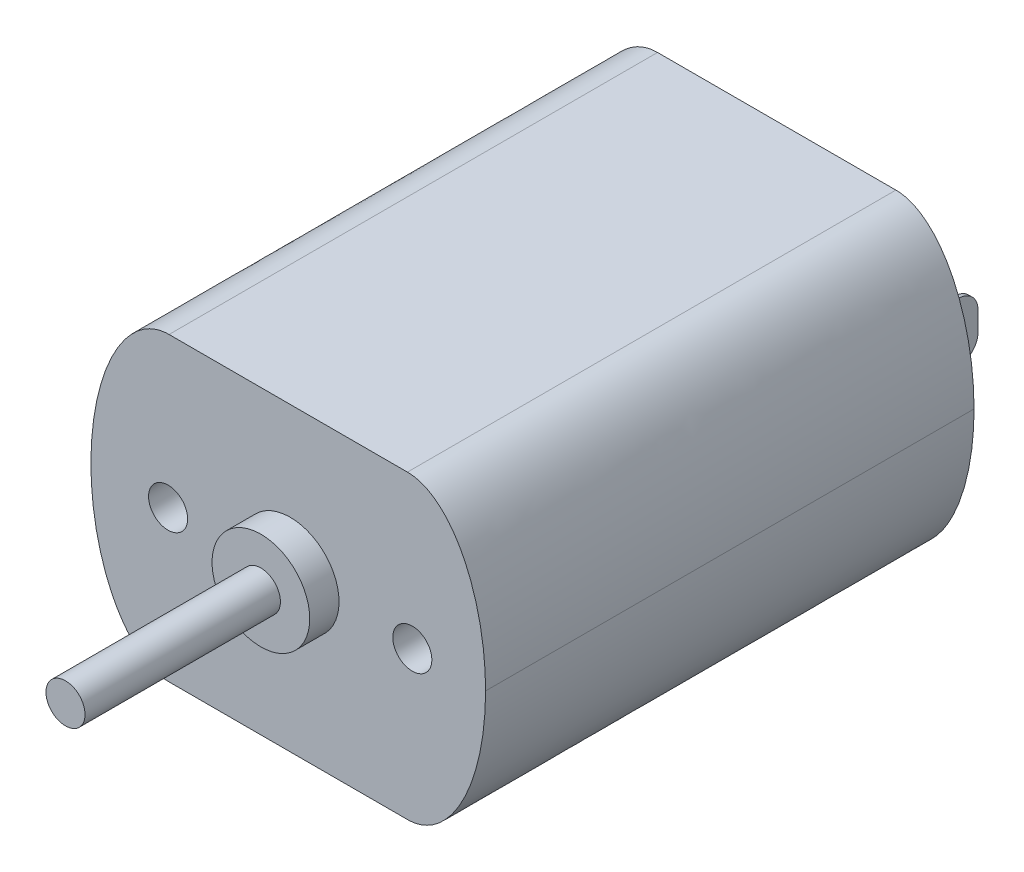
ISO-10303-21;
HEADER;
FILE_DESCRIPTION(('STEP AP214'),'2;1');
FILE_NAME('part.step','',(''),(''),'','','');
FILE_SCHEMA(('AUTOMOTIVE_DESIGN { 1 0 10303 214 1 1 1 1 }'));
ENDSEC;
DATA;
#1=APPLICATION_CONTEXT('core data for automotive mechanical design processes');
#2=APPLICATION_PROTOCOL_DEFINITION('international standard','automotive_design',2000,#1);
#3=PRODUCT_CONTEXT('',#1,'mechanical');
#4=PRODUCT('Part','Part','',(#3));
#5=PRODUCT_RELATED_PRODUCT_CATEGORY('part','',(#4));
#6=PRODUCT_DEFINITION_FORMATION('','',#4);
#7=PRODUCT_DEFINITION_CONTEXT('part definition',#1,'design');
#8=PRODUCT_DEFINITION('design','',#6,#7);
#9=PRODUCT_DEFINITION_SHAPE('','',#8);
#10=(LENGTH_UNIT() NAMED_UNIT(*) SI_UNIT(.MILLI.,.METRE.));
#11=(NAMED_UNIT(*) PLANE_ANGLE_UNIT() SI_UNIT($,.RADIAN.));
#12=(NAMED_UNIT(*) SI_UNIT($,.STERADIAN.) SOLID_ANGLE_UNIT());
#13=UNCERTAINTY_MEASURE_WITH_UNIT(LENGTH_MEASURE(1.E-05),#10,'distance_accuracy_value','');
#14=(GEOMETRIC_REPRESENTATION_CONTEXT(3) GLOBAL_UNCERTAINTY_ASSIGNED_CONTEXT((#13)) GLOBAL_UNIT_ASSIGNED_CONTEXT((#10,
#11,#12)) REPRESENTATION_CONTEXT('',''));
#15=CARTESIAN_POINT('',(0.,0.,0.));
#16=DIRECTION('',(0.,0.,1.));
#17=DIRECTION('',(1.,0.,0.));
#18=AXIS2_PLACEMENT_3D('',#15,#16,#17);
#19=CARTESIAN_POINT('',(0.,0.,0.));
#20=DIRECTION('',(0.,0.,1.));
#21=DIRECTION('',(1.,0.,0.));
#22=AXIS2_PLACEMENT_3D('',#19,#20,#21);
#23=PLANE('',#22);
#24=DIRECTION('',(0.,1.,0.));
#25=VECTOR('',#24,1.);
#26=CARTESIAN_POINT('',(3.43641970874842,-6.2,0.));
#27=LINE('',#26,#25);
#28=CARTESIAN_POINT('',(3.43641970874842,-9.2,0.));
#29=VERTEX_POINT('',#28);
#30=CARTESIAN_POINT('',(3.43641970874842,-6.2,0.));
#31=VERTEX_POINT('',#30);
#32=EDGE_CURVE('E201',#29,#31,#27,.T.);
#33=ORIENTED_EDGE('',*,*,#32,.F.);
#34=DIRECTION('',(-1.,0.,0.));
#35=VECTOR('',#34,1.);
#36=CARTESIAN_POINT('',(3.43641970874842,-9.2,0.));
#37=LINE('',#36,#35);
#38=CARTESIAN_POINT('',(3.63641970874842,-9.2,0.));
#39=VERTEX_POINT('',#38);
#40=EDGE_CURVE('E206',#39,#29,#37,.T.);
#41=ORIENTED_EDGE('',*,*,#40,.F.);
#42=DIRECTION('',(0.,-1.,0.));
#43=VECTOR('',#42,1.);
#44=CARTESIAN_POINT('',(3.63641970874842,-6.2,0.));
#45=LINE('',#44,#43);
#46=CARTESIAN_POINT('',(3.63641970874842,-6.2,0.));
#47=VERTEX_POINT('',#46);
#48=EDGE_CURVE('E215',#47,#39,#45,.T.);
#49=ORIENTED_EDGE('',*,*,#48,.F.);
#50=DIRECTION('',(1.,0.,0.));
#51=VECTOR('',#50,1.);
#52=CARTESIAN_POINT('',(3.43641970874842,-6.2,0.));
#53=LINE('',#52,#51);
#54=EDGE_CURVE('E212',#31,#47,#53,.T.);
#55=ORIENTED_EDGE('',*,*,#54,.F.);
#56=EDGE_LOOP('',(#33,#41,#49,#55));
#57=FACE_BOUND('',#56,.T.);
#58=CARTESIAN_POINT('',(10.1,-7.7,0.));
#59=DIRECTION('',(0.,0.,1.));
#60=DIRECTION('',(1.,0.,0.));
#61=AXIS2_PLACEMENT_3D('',#58,#59,#60);
#62=CIRCLE('',#61,2.5);
#63=CARTESIAN_POINT('',(12.6,-7.7,0.));
#64=VERTEX_POINT('',#63);
#65=EDGE_CURVE('E478',#64,#64,#62,.F.);
#66=ORIENTED_EDGE('',*,*,#65,.F.);
#67=EDGE_LOOP('',(#66));
#68=FACE_BOUND('',#67,.T.);
#69=DIRECTION('',(1.,0.,0.));
#70=VECTOR('',#69,1.);
#71=CARTESIAN_POINT('',(0.,-15.4,0.));
#72=LINE('',#71,#70);
#73=CARTESIAN_POINT('',(4.,-15.4,0.));
#74=VERTEX_POINT('',#73);
#75=CARTESIAN_POINT('',(16.2,-15.4,0.));
#76=VERTEX_POINT('',#75);
#77=EDGE_CURVE('E252',#74,#76,#72,.T.);
#78=ORIENTED_EDGE('',*,*,#77,.F.);
#79=CARTESIAN_POINT('',(0.,-7.7,0.));
#80=CARTESIAN_POINT('',(0.,-15.4,0.));
#81=CARTESIAN_POINT('',(4.,-15.4,0.));
#82=(BOUNDED_CURVE() B_SPLINE_CURVE(2,(#79,#80,#81),.UNSPECIFIED.,.F.,
.F.) B_SPLINE_CURVE_WITH_KNOTS((3,3),(0.,1.),
.UNSPECIFIED.) CURVE() GEOMETRIC_REPRESENTATION_ITEM() RATIONAL_B_SPLINE_CURVE((1.,
0.707106781186548,1.)) REPRESENTATION_ITEM(''));
#83=CARTESIAN_POINT('',(0.,-7.7,0.));
#84=VERTEX_POINT('',#83);
#85=EDGE_CURVE('E380',#74,#84,#82,.F.);
#86=ORIENTED_EDGE('',*,*,#85,.T.);
#87=CARTESIAN_POINT('',(4.,0.,0.));
#88=CARTESIAN_POINT('',(0.,0.,0.));
#89=CARTESIAN_POINT('',(0.,-7.7,0.));
#90=(BOUNDED_CURVE() B_SPLINE_CURVE(2,(#87,#88,#89),.UNSPECIFIED.,.F.,
.F.) B_SPLINE_CURVE_WITH_KNOTS((3,3),(0.,1.),
.UNSPECIFIED.) CURVE() GEOMETRIC_REPRESENTATION_ITEM() RATIONAL_B_SPLINE_CURVE((1.,
0.707106781186548,1.)) REPRESENTATION_ITEM(''));
#91=CARTESIAN_POINT('',(4.,0.,0.));
#92=VERTEX_POINT('',#91);
#93=EDGE_CURVE('E582',#84,#92,#90,.F.);
#94=ORIENTED_EDGE('',*,*,#93,.T.);
#95=DIRECTION('',(-1.,0.,0.));
#96=VECTOR('',#95,1.);
#97=CARTESIAN_POINT('',(0.,0.,0.));
#98=LINE('',#97,#96);
#99=CARTESIAN_POINT('',(16.2,0.,0.));
#100=VERTEX_POINT('',#99);
#101=EDGE_CURVE('E264',#100,#92,#98,.T.);
#102=ORIENTED_EDGE('',*,*,#101,.F.);
#103=CARTESIAN_POINT('',(20.2,-7.7,0.));
#104=CARTESIAN_POINT('',(20.2,0.,0.));
#105=CARTESIAN_POINT('',(16.2,0.,0.));
#106=(BOUNDED_CURVE() B_SPLINE_CURVE(2,(#103,#104,#105),.UNSPECIFIED.,.F.,
.F.) B_SPLINE_CURVE_WITH_KNOTS((3,3),(0.,1.),
.UNSPECIFIED.) CURVE() GEOMETRIC_REPRESENTATION_ITEM() RATIONAL_B_SPLINE_CURVE((1.,
0.707106781186548,1.)) REPRESENTATION_ITEM(''));
#107=CARTESIAN_POINT('',(20.2,-7.7,0.));
#108=VERTEX_POINT('',#107);
#109=EDGE_CURVE('E443',#100,#108,#106,.F.);
#110=ORIENTED_EDGE('',*,*,#109,.T.);
#111=CARTESIAN_POINT('',(16.2,-15.4,0.));
#112=CARTESIAN_POINT('',(20.2,-15.4,0.));
#113=CARTESIAN_POINT('',(20.2,-7.7,0.));
#114=(BOUNDED_CURVE() B_SPLINE_CURVE(2,(#111,#112,#113),.UNSPECIFIED.,.F.,
.F.) B_SPLINE_CURVE_WITH_KNOTS((3,3),(0.,1.),
.UNSPECIFIED.) CURVE() GEOMETRIC_REPRESENTATION_ITEM() RATIONAL_B_SPLINE_CURVE((1.,
0.707106781186547,1.)) REPRESENTATION_ITEM(''));
#115=EDGE_CURVE('E576',#108,#76,#114,.F.);
#116=ORIENTED_EDGE('',*,*,#115,.T.);
#117=EDGE_LOOP('',(#78,#86,#94,#102,#110,#116));
#118=FACE_BOUND('',#117,.T.);
#119=DIRECTION('',(0.,1.,0.));
#120=VECTOR('',#119,1.);
#121=CARTESIAN_POINT('',(16.2023682946635,-6.2,0.));
#122=LINE('',#121,#120);
#123=CARTESIAN_POINT('',(16.2023682946635,-9.2,0.));
#124=VERTEX_POINT('',#123);
#125=CARTESIAN_POINT('',(16.2023682946635,-6.2,0.));
#126=VERTEX_POINT('',#125);
#127=EDGE_CURVE('E171',#124,#126,#122,.T.);
#128=ORIENTED_EDGE('',*,*,#127,.F.);
#129=DIRECTION('',(-1.,0.,0.));
#130=VECTOR('',#129,1.);
#131=CARTESIAN_POINT('',(16.2023682946635,-9.2,0.));
#132=LINE('',#131,#130);
#133=CARTESIAN_POINT('',(16.4023682946635,-9.2,0.));
#134=VERTEX_POINT('',#133);
#135=EDGE_CURVE('E181',#134,#124,#132,.T.);
#136=ORIENTED_EDGE('',*,*,#135,.F.);
#137=DIRECTION('',(0.,-1.,0.));
#138=VECTOR('',#137,1.);
#139=CARTESIAN_POINT('',(16.4023682946635,-6.2,0.));
#140=LINE('',#139,#138);
#141=CARTESIAN_POINT('',(16.4023682946635,-6.2,0.));
#142=VERTEX_POINT('',#141);
#143=EDGE_CURVE('E189',#142,#134,#140,.T.);
#144=ORIENTED_EDGE('',*,*,#143,.F.);
#145=DIRECTION('',(1.,0.,0.));
#146=VECTOR('',#145,1.);
#147=CARTESIAN_POINT('',(16.2023682946635,-6.2,0.));
#148=LINE('',#147,#146);
#149=EDGE_CURVE('E184',#126,#142,#148,.T.);
#150=ORIENTED_EDGE('',*,*,#149,.F.);
#151=EDGE_LOOP('',(#128,#136,#144,#150));
#152=FACE_BOUND('',#151,.T.);
#153=ADVANCED_FACE('F41',(#57,#68,#118,#152),#23,.F.);
#154=CARTESIAN_POINT('',(0.,-15.4,25.));
#155=DIRECTION('',(0.,1.,0.));
#156=DIRECTION('',(0.,0.,1.));
#157=AXIS2_PLACEMENT_3D('',#154,#155,#156);
#158=PLANE('',#157);
#159=DIRECTION('',(1.,0.,0.));
#160=VECTOR('',#159,1.);
#161=CARTESIAN_POINT('',(0.,-15.4,25.));
#162=LINE('',#161,#160);
#163=CARTESIAN_POINT('',(4.,-15.4,25.));
#164=VERTEX_POINT('',#163);
#165=CARTESIAN_POINT('',(16.2,-15.4,25.));
#166=VERTEX_POINT('',#165);
#167=EDGE_CURVE('E260',#164,#166,#162,.T.);
#168=ORIENTED_EDGE('',*,*,#167,.F.);
#169=CARTESIAN_POINT('',(4.,-15.4,-1.25));
#170=CARTESIAN_POINT('',(4.,-15.4,7.91666666666666));
#171=CARTESIAN_POINT('',(4.,-15.4,17.0833333333333));
#172=CARTESIAN_POINT('',(4.,-15.4,26.25));
#173=(BOUNDED_CURVE() B_SPLINE_CURVE(3,(#169,#170,#171,#172),.UNSPECIFIED.,.F.,
.F.) B_SPLINE_CURVE_WITH_KNOTS((4,4),(-0.00125,0.02625),
.UNSPECIFIED.) CURVE() GEOMETRIC_REPRESENTATION_ITEM() RATIONAL_B_SPLINE_CURVE((1.,1.,1.,1.)) REPRESENTATION_ITEM(''));
#174=EDGE_CURVE('E271',#164,#74,#173,.F.);
#175=ORIENTED_EDGE('',*,*,#174,.T.);
#176=ORIENTED_EDGE('',*,*,#77,.T.);
#177=CARTESIAN_POINT('',(16.2,-15.4,26.25));
#178=CARTESIAN_POINT('',(16.2,-15.4,17.0833333333333));
#179=CARTESIAN_POINT('',(16.2,-15.4,7.91666666666666));
#180=CARTESIAN_POINT('',(16.2,-15.4,-1.25));
#181=(BOUNDED_CURVE() B_SPLINE_CURVE(3,(#177,#178,#179,#180),.UNSPECIFIED.,.F.,
.F.) B_SPLINE_CURVE_WITH_KNOTS((4,4),(-0.00125,0.02625),
.UNSPECIFIED.) CURVE() GEOMETRIC_REPRESENTATION_ITEM() RATIONAL_B_SPLINE_CURVE((1.,1.,1.,1.)) REPRESENTATION_ITEM(''));
#182=EDGE_CURVE('E633',#76,#166,#181,.F.);
#183=ORIENTED_EDGE('',*,*,#182,.T.);
#184=EDGE_LOOP('',(#168,#175,#176,#183));
#185=FACE_BOUND('',#184,.T.);
#186=ADVANCED_FACE('F279',(#185),#158,.F.);
#187=CARTESIAN_POINT('',(0.,0.,25.));
#188=DIRECTION('',(0.,-1.,0.));
#189=DIRECTION('',(0.,0.,-1.));
#190=AXIS2_PLACEMENT_3D('',#187,#188,#189);
#191=PLANE('',#190);
#192=DIRECTION('',(-1.,0.,0.));
#193=VECTOR('',#192,1.);
#194=CARTESIAN_POINT('',(0.,0.,25.));
#195=LINE('',#194,#193);
#196=CARTESIAN_POINT('',(16.2,0.,25.));
#197=VERTEX_POINT('',#196);
#198=CARTESIAN_POINT('',(4.,0.,25.));
#199=VERTEX_POINT('',#198);
#200=EDGE_CURVE('E263',#197,#199,#195,.T.);
#201=ORIENTED_EDGE('',*,*,#200,.F.);
#202=CARTESIAN_POINT('',(16.2,0.,-1.25));
#203=CARTESIAN_POINT('',(16.2,0.,7.91666666666666));
#204=CARTESIAN_POINT('',(16.2,0.,17.0833333333333));
#205=CARTESIAN_POINT('',(16.2,0.,26.25));
#206=(BOUNDED_CURVE() B_SPLINE_CURVE(3,(#202,#203,#204,#205),.UNSPECIFIED.,.F.,
.F.) B_SPLINE_CURVE_WITH_KNOTS((4,4),(-0.00125,0.02625),
.UNSPECIFIED.) CURVE() GEOMETRIC_REPRESENTATION_ITEM() RATIONAL_B_SPLINE_CURVE((1.,1.,1.,1.)) REPRESENTATION_ITEM(''));
#207=EDGE_CURVE('E367',#197,#100,#206,.F.);
#208=ORIENTED_EDGE('',*,*,#207,.T.);
#209=ORIENTED_EDGE('',*,*,#101,.T.);
#210=CARTESIAN_POINT('',(4.,0.,26.25));
#211=CARTESIAN_POINT('',(4.,0.,17.0833333333333));
#212=CARTESIAN_POINT('',(4.,0.,7.91666666666666));
#213=CARTESIAN_POINT('',(4.,0.,-1.25));
#214=(BOUNDED_CURVE() B_SPLINE_CURVE(3,(#210,#211,#212,#213),.UNSPECIFIED.,.F.,
.F.) B_SPLINE_CURVE_WITH_KNOTS((4,4),(-0.00125,0.02625),
.UNSPECIFIED.) CURVE() GEOMETRIC_REPRESENTATION_ITEM() RATIONAL_B_SPLINE_CURVE((1.,1.,1.,1.)) REPRESENTATION_ITEM(''));
#215=EDGE_CURVE('E581',#92,#199,#214,.F.);
#216=ORIENTED_EDGE('',*,*,#215,.T.);
#217=EDGE_LOOP('',(#201,#208,#209,#216));
#218=FACE_BOUND('',#217,.T.);
#219=ADVANCED_FACE('F289',(#218),#191,.F.);
#220=CARTESIAN_POINT('',(0.,0.,25.));
#221=DIRECTION('',(0.,0.,1.));
#222=DIRECTION('',(1.,0.,0.));
#223=AXIS2_PLACEMENT_3D('',#220,#221,#222);
#224=PLANE('',#223);
#225=CARTESIAN_POINT('',(16.45,-7.7,25.));
#226=DIRECTION('',(0.,0.,1.));
#227=DIRECTION('',(1.,0.,0.));
#228=AXIS2_PLACEMENT_3D('',#225,#226,#227);
#229=CIRCLE('',#228,1.);
#230=CARTESIAN_POINT('',(17.45,-7.7,25.));
#231=VERTEX_POINT('',#230);
#232=EDGE_CURVE('E230',#231,#231,#229,.T.);
#233=ORIENTED_EDGE('',*,*,#232,.F.);
#234=EDGE_LOOP('',(#233));
#235=FACE_BOUND('',#234,.T.);
#236=CARTESIAN_POINT('',(3.95,-7.7,25.));
#237=DIRECTION('',(0.,0.,1.));
#238=DIRECTION('',(1.,0.,0.));
#239=AXIS2_PLACEMENT_3D('',#236,#237,#238);
#240=CIRCLE('',#239,1.);
#241=CARTESIAN_POINT('',(4.95,-7.7,25.));
#242=VERTEX_POINT('',#241);
#243=EDGE_CURVE('E234',#242,#242,#240,.T.);
#244=ORIENTED_EDGE('',*,*,#243,.F.);
#245=EDGE_LOOP('',(#244));
#246=FACE_BOUND('',#245,.T.);
#247=CARTESIAN_POINT('',(10.2,-7.5,25.));
#248=DIRECTION('',(0.,0.,1.));
#249=DIRECTION('',(1.,0.,0.));
#250=AXIS2_PLACEMENT_3D('',#247,#248,#249);
#251=CIRCLE('',#250,2.5);
#252=CARTESIAN_POINT('',(12.7,-7.5,25.));
#253=VERTEX_POINT('',#252);
#254=EDGE_CURVE('E246',#253,#253,#251,.T.);
#255=ORIENTED_EDGE('',*,*,#254,.F.);
#256=EDGE_LOOP('',(#255));
#257=FACE_BOUND('',#256,.T.);
#258=CARTESIAN_POINT('',(0.,-7.7,25.));
#259=CARTESIAN_POINT('',(0.,0.,25.));
#260=CARTESIAN_POINT('',(4.,0.,25.));
#261=(BOUNDED_CURVE() B_SPLINE_CURVE(2,(#258,#259,#260),.UNSPECIFIED.,.F.,
.F.) B_SPLINE_CURVE_WITH_KNOTS((3,3),(0.,1.),
.UNSPECIFIED.) CURVE() GEOMETRIC_REPRESENTATION_ITEM() RATIONAL_B_SPLINE_CURVE((1.,
0.707106781186548,1.)) REPRESENTATION_ITEM(''));
#262=CARTESIAN_POINT('',(0.,-7.7,25.));
#263=VERTEX_POINT('',#262);
#264=EDGE_CURVE('E314',#199,#263,#261,.F.);
#265=ORIENTED_EDGE('',*,*,#264,.T.);
#266=CARTESIAN_POINT('',(4.,-15.4,25.));
#267=CARTESIAN_POINT('',(0.,-15.4,25.));
#268=CARTESIAN_POINT('',(0.,-7.7,25.));
#269=(BOUNDED_CURVE() B_SPLINE_CURVE(2,(#266,#267,#268),.UNSPECIFIED.,.F.,
.F.) B_SPLINE_CURVE_WITH_KNOTS((3,3),(0.,1.),
.UNSPECIFIED.) CURVE() GEOMETRIC_REPRESENTATION_ITEM() RATIONAL_B_SPLINE_CURVE((1.,
0.707106781186548,1.)) REPRESENTATION_ITEM(''));
#270=EDGE_CURVE('E353',#263,#164,#269,.F.);
#271=ORIENTED_EDGE('',*,*,#270,.T.);
#272=ORIENTED_EDGE('',*,*,#167,.T.);
#273=CARTESIAN_POINT('',(20.2,-7.7,25.));
#274=CARTESIAN_POINT('',(20.2,-15.4,25.));
#275=CARTESIAN_POINT('',(16.2,-15.4,25.));
#276=(BOUNDED_CURVE() B_SPLINE_CURVE(2,(#273,#274,#275),.UNSPECIFIED.,.F.,
.F.) B_SPLINE_CURVE_WITH_KNOTS((3,3),(0.,1.),
.UNSPECIFIED.) CURVE() GEOMETRIC_REPRESENTATION_ITEM() RATIONAL_B_SPLINE_CURVE((1.,
0.707106781186547,1.)) REPRESENTATION_ITEM(''));
#277=CARTESIAN_POINT('',(20.2,-7.7,25.));
#278=VERTEX_POINT('',#277);
#279=EDGE_CURVE('E643',#166,#278,#276,.F.);
#280=ORIENTED_EDGE('',*,*,#279,.T.);
#281=CARTESIAN_POINT('',(16.2,0.,25.));
#282=CARTESIAN_POINT('',(20.2,0.,25.));
#283=CARTESIAN_POINT('',(20.2,-7.7,25.));
#284=(BOUNDED_CURVE() B_SPLINE_CURVE(2,(#281,#282,#283),.UNSPECIFIED.,.F.,
.F.) B_SPLINE_CURVE_WITH_KNOTS((3,3),(0.,1.),
.UNSPECIFIED.) CURVE() GEOMETRIC_REPRESENTATION_ITEM() RATIONAL_B_SPLINE_CURVE((1.,
0.707106781186548,1.)) REPRESENTATION_ITEM(''));
#285=EDGE_CURVE('E463',#278,#197,#284,.F.);
#286=ORIENTED_EDGE('',*,*,#285,.T.);
#287=ORIENTED_EDGE('',*,*,#200,.T.);
#288=EDGE_LOOP('',(#265,#271,#272,#280,#286,#287));
#289=FACE_BOUND('',#288,.T.);
#290=ADVANCED_FACE('F321',(#235,#246,#257,#289),#224,.T.);
#291=CARTESIAN_POINT('',(10.2,-7.5,26.5));
#292=DIRECTION('',(0.,0.,-1.));
#293=DIRECTION('',(-1.,0.,0.));
#294=AXIS2_PLACEMENT_3D('',#291,#292,#293);
#295=CYLINDRICAL_SURFACE('',#294,2.5);
#296=CARTESIAN_POINT('',(10.2,-7.5,26.5));
#297=DIRECTION('',(0.,0.,1.));
#298=DIRECTION('',(1.,0.,0.));
#299=AXIS2_PLACEMENT_3D('',#296,#297,#298);
#300=CIRCLE('',#299,2.5);
#301=CARTESIAN_POINT('',(12.7,-7.5,26.5));
#302=VERTEX_POINT('',#301);
#303=EDGE_CURVE('E249',#302,#302,#300,.T.);
#304=ORIENTED_EDGE('',*,*,#303,.F.);
#305=EDGE_LOOP('',(#304));
#306=FACE_BOUND('',#305,.T.);
#307=ORIENTED_EDGE('',*,*,#254,.T.);
#308=EDGE_LOOP('',(#307));
#309=FACE_BOUND('',#308,.T.);
#310=ADVANCED_FACE('F330',(#306,#309),#295,.T.);
#311=CARTESIAN_POINT('',(10.2,-7.5,26.5));
#312=DIRECTION('',(0.,0.,1.));
#313=DIRECTION('',(1.,0.,0.));
#314=AXIS2_PLACEMENT_3D('',#311,#312,#313);
#315=PLANE('',#314);
#316=CARTESIAN_POINT('',(10.2,-7.5,26.5));
#317=DIRECTION('',(0.,0.,1.));
#318=DIRECTION('',(1.,0.,0.));
#319=AXIS2_PLACEMENT_3D('',#316,#317,#318);
#320=CIRCLE('',#319,1.);
#321=CARTESIAN_POINT('',(11.2,-7.5,26.5));
#322=VERTEX_POINT('',#321);
#323=EDGE_CURVE('E240',#322,#322,#320,.T.);
#324=ORIENTED_EDGE('',*,*,#323,.F.);
#325=EDGE_LOOP('',(#324));
#326=FACE_BOUND('',#325,.T.);
#327=ORIENTED_EDGE('',*,*,#303,.T.);
#328=EDGE_LOOP('',(#327));
#329=FACE_BOUND('',#328,.T.);
#330=ADVANCED_FACE('F697',(#326,#329),#315,.T.);
#331=CARTESIAN_POINT('',(10.2,-7.5,36.5));
#332=DIRECTION('',(0.,0.,-1.));
#333=DIRECTION('',(-1.,0.,0.));
#334=AXIS2_PLACEMENT_3D('',#331,#332,#333);
#335=CYLINDRICAL_SURFACE('',#334,1.);
#336=CARTESIAN_POINT('',(10.2,-7.5,36.5));
#337=DIRECTION('',(0.,0.,1.));
#338=DIRECTION('',(1.,0.,0.));
#339=AXIS2_PLACEMENT_3D('',#336,#337,#338);
#340=CIRCLE('',#339,1.);
#341=CARTESIAN_POINT('',(11.2,-7.5,36.5));
#342=VERTEX_POINT('',#341);
#343=EDGE_CURVE('E243',#342,#342,#340,.T.);
#344=ORIENTED_EDGE('',*,*,#343,.F.);
#345=EDGE_LOOP('',(#344));
#346=FACE_BOUND('',#345,.T.);
#347=ORIENTED_EDGE('',*,*,#323,.T.);
#348=EDGE_LOOP('',(#347));
#349=FACE_BOUND('',#348,.T.);
#350=ADVANCED_FACE('F691',(#346,#349),#335,.T.);
#351=CARTESIAN_POINT('',(10.2,-7.5,36.5));
#352=DIRECTION('',(0.,0.,1.));
#353=DIRECTION('',(1.,0.,0.));
#354=AXIS2_PLACEMENT_3D('',#351,#352,#353);
#355=PLANE('',#354);
#356=ORIENTED_EDGE('',*,*,#343,.T.);
#357=EDGE_LOOP('',(#356));
#358=FACE_BOUND('',#357,.T.);
#359=ADVANCED_FACE('F686',(#358),#355,.T.);
#360=CARTESIAN_POINT('',(20.2,-7.7,26.25));
#361=CARTESIAN_POINT('',(20.2,-7.7,17.0833333333333));
#362=CARTESIAN_POINT('',(20.2,-7.7,7.91666666666666));
#363=CARTESIAN_POINT('',(20.2,-7.7,-1.25));
#364=CARTESIAN_POINT('',(20.2,-15.4,26.25));
#365=CARTESIAN_POINT('',(20.2,-15.4,17.0833333333333));
#366=CARTESIAN_POINT('',(20.2,-15.4,7.91666666666667));
#367=CARTESIAN_POINT('',(20.2,-15.4,-1.25));
#368=CARTESIAN_POINT('',(16.2,-15.4,26.25));
#369=CARTESIAN_POINT('',(16.2,-15.4,17.0833333333333));
#370=CARTESIAN_POINT('',(16.2,-15.4,7.91666666666666));
#371=CARTESIAN_POINT('',(16.2,-15.4,-1.25));
#372=(BOUNDED_SURFACE() B_SPLINE_SURFACE(2,3,((#360,#361,#362,#363),(#364,#365,#366,#367),(#368,
#369,#370,#371)),.UNSPECIFIED.,.F.,.F.,.F.) B_SPLINE_SURFACE_WITH_KNOTS((3,3),(4,4),(0.,1.),
(-0.00125,0.02625),
.UNSPECIFIED.) GEOMETRIC_REPRESENTATION_ITEM() RATIONAL_B_SPLINE_SURFACE(((1.,1.,1.,1.),
(0.707106781186547,0.707106781186547,0.707106781186547,0.707106781186547),(1.,1.,1.,1.))) REPRESENTATION_ITEM('') SURFACE());
#373=CARTESIAN_POINT('',(20.2,-7.7,26.25));
#374=CARTESIAN_POINT('',(20.2,-7.7,17.0833333333333));
#375=CARTESIAN_POINT('',(20.2,-7.7,7.91666666666666));
#376=CARTESIAN_POINT('',(20.2,-7.7,-1.25));
#377=(BOUNDED_CURVE() B_SPLINE_CURVE(3,(#373,#374,#375,#376),.UNSPECIFIED.,.F.,
.F.) B_SPLINE_CURVE_WITH_KNOTS((4,4),(-0.00125,0.02625),
.UNSPECIFIED.) CURVE() GEOMETRIC_REPRESENTATION_ITEM() RATIONAL_B_SPLINE_CURVE((1.,1.,1.,1.)) REPRESENTATION_ITEM(''));
#378=EDGE_CURVE('E474',#278,#108,#377,.T.);
#379=ORIENTED_EDGE('',*,*,#279,.F.);
#380=ORIENTED_EDGE('',*,*,#182,.F.);
#381=ORIENTED_EDGE('',*,*,#115,.F.);
#382=ORIENTED_EDGE('',*,*,#378,.F.);
#383=EDGE_LOOP('',(#379,#380,#381,#382));
#384=FACE_BOUND('',#383,.T.);
#385=ADVANCED_FACE('F293',(#384),#372,.T.);
#386=CARTESIAN_POINT('',(0.,-7.7,26.25));
#387=CARTESIAN_POINT('',(0.,-7.7,17.0833333333333));
#388=CARTESIAN_POINT('',(0.,-7.7,7.91666666666666));
#389=CARTESIAN_POINT('',(0.,-7.7,-1.25));
#390=CARTESIAN_POINT('',(0.,0.,26.25));
#391=CARTESIAN_POINT('',(0.,0.,17.0833333333333));
#392=CARTESIAN_POINT('',(0.,0.,7.91666666666667));
#393=CARTESIAN_POINT('',(0.,0.,-1.25));
#394=CARTESIAN_POINT('',(4.,0.,26.25));
#395=CARTESIAN_POINT('',(4.,0.,17.0833333333333));
#396=CARTESIAN_POINT('',(4.,0.,7.91666666666666));
#397=CARTESIAN_POINT('',(4.,0.,-1.25));
#398=(BOUNDED_SURFACE() B_SPLINE_SURFACE(2,3,((#386,#387,#388,#389),(#390,#391,#392,#393),(#394,
#395,#396,#397)),.UNSPECIFIED.,.F.,.F.,.F.) B_SPLINE_SURFACE_WITH_KNOTS((3,3),(4,4),(0.,1.),
(-0.00125,0.02625),
.UNSPECIFIED.) GEOMETRIC_REPRESENTATION_ITEM() RATIONAL_B_SPLINE_SURFACE(((1.,1.,1.,1.),
(0.707106781186548,0.707106781186548,0.707106781186548,0.707106781186548),(1.,1.,1.,1.))) REPRESENTATION_ITEM('') SURFACE());
#399=CARTESIAN_POINT('',(0.,-7.7,26.25));
#400=CARTESIAN_POINT('',(0.,-7.7,17.0833333333333));
#401=CARTESIAN_POINT('',(0.,-7.7,7.91666666666666));
#402=CARTESIAN_POINT('',(0.,-7.7,-1.25));
#403=(BOUNDED_CURVE() B_SPLINE_CURVE(3,(#399,#400,#401,#402),.UNSPECIFIED.,.F.,
.F.) B_SPLINE_CURVE_WITH_KNOTS((4,4),(-0.00125,0.02625),
.UNSPECIFIED.) CURVE() GEOMETRIC_REPRESENTATION_ITEM() RATIONAL_B_SPLINE_CURVE((1.,1.,1.,1.)) REPRESENTATION_ITEM(''));
#404=EDGE_CURVE('E431',#263,#84,#403,.T.);
#405=ORIENTED_EDGE('',*,*,#264,.F.);
#406=ORIENTED_EDGE('',*,*,#215,.F.);
#407=ORIENTED_EDGE('',*,*,#93,.F.);
#408=ORIENTED_EDGE('',*,*,#404,.F.);
#409=EDGE_LOOP('',(#405,#406,#407,#408));
#410=FACE_BOUND('',#409,.T.);
#411=ADVANCED_FACE('F402',(#410),#398,.T.);
#412=CARTESIAN_POINT('',(4.,-15.4,26.25));
#413=CARTESIAN_POINT('',(4.,-15.4,17.0833333333333));
#414=CARTESIAN_POINT('',(4.,-15.4,7.91666666666666));
#415=CARTESIAN_POINT('',(4.,-15.4,-1.25));
#416=CARTESIAN_POINT('',(0.,-15.4,26.25));
#417=CARTESIAN_POINT('',(0.,-15.4,17.0833333333333));
#418=CARTESIAN_POINT('',(0.,-15.4,7.91666666666667));
#419=CARTESIAN_POINT('',(0.,-15.4,-1.25));
#420=CARTESIAN_POINT('',(0.,-7.7,26.25));
#421=CARTESIAN_POINT('',(0.,-7.7,17.0833333333333));
#422=CARTESIAN_POINT('',(0.,-7.7,7.91666666666666));
#423=CARTESIAN_POINT('',(0.,-7.7,-1.25));
#424=(BOUNDED_SURFACE() B_SPLINE_SURFACE(2,3,((#412,#413,#414,#415),(#416,#417,#418,#419),(#420,
#421,#422,#423)),.UNSPECIFIED.,.F.,.F.,.F.) B_SPLINE_SURFACE_WITH_KNOTS((3,3),(4,4),(0.,1.),
(-0.00125,0.02625),
.UNSPECIFIED.) GEOMETRIC_REPRESENTATION_ITEM() RATIONAL_B_SPLINE_SURFACE(((1.,1.,1.,1.),
(0.707106781186548,0.707106781186548,0.707106781186548,0.707106781186548),(1.,1.,1.,1.))) REPRESENTATION_ITEM('') SURFACE());
#425=ORIENTED_EDGE('',*,*,#270,.F.);
#426=ORIENTED_EDGE('',*,*,#404,.T.);
#427=ORIENTED_EDGE('',*,*,#85,.F.);
#428=ORIENTED_EDGE('',*,*,#174,.F.);
#429=EDGE_LOOP('',(#425,#426,#427,#428));
#430=FACE_BOUND('',#429,.T.);
#431=ADVANCED_FACE('F387',(#430),#424,.T.);
#432=CARTESIAN_POINT('',(16.2,0.,26.25));
#433=CARTESIAN_POINT('',(16.2,0.,17.0833333333333));
#434=CARTESIAN_POINT('',(16.2,0.,7.91666666666666));
#435=CARTESIAN_POINT('',(16.2,0.,-1.25));
#436=CARTESIAN_POINT('',(20.2,0.,26.25));
#437=CARTESIAN_POINT('',(20.2,0.,17.0833333333333));
#438=CARTESIAN_POINT('',(20.2,0.,7.91666666666667));
#439=CARTESIAN_POINT('',(20.2,0.,-1.25));
#440=CARTESIAN_POINT('',(20.2,-7.7,26.25));
#441=CARTESIAN_POINT('',(20.2,-7.7,17.0833333333333));
#442=CARTESIAN_POINT('',(20.2,-7.7,7.91666666666666));
#443=CARTESIAN_POINT('',(20.2,-7.7,-1.25));
#444=(BOUNDED_SURFACE() B_SPLINE_SURFACE(2,3,((#432,#433,#434,#435),(#436,#437,#438,#439),(#440,
#441,#442,#443)),.UNSPECIFIED.,.F.,.F.,.F.) B_SPLINE_SURFACE_WITH_KNOTS((3,3),(4,4),(0.,1.),
(-0.00125,0.02625),
.UNSPECIFIED.) GEOMETRIC_REPRESENTATION_ITEM() RATIONAL_B_SPLINE_SURFACE(((1.,1.,1.,1.),
(0.707106781186548,0.707106781186548,0.707106781186548,0.707106781186548),(1.,1.,1.,1.))) REPRESENTATION_ITEM('') SURFACE());
#445=ORIENTED_EDGE('',*,*,#285,.F.);
#446=ORIENTED_EDGE('',*,*,#378,.T.);
#447=ORIENTED_EDGE('',*,*,#109,.F.);
#448=ORIENTED_EDGE('',*,*,#207,.F.);
#449=EDGE_LOOP('',(#445,#446,#447,#448));
#450=FACE_BOUND('',#449,.T.);
#451=ADVANCED_FACE('F401',(#450),#444,.T.);
#452=CARTESIAN_POINT('',(3.95,-7.7,20.));
#453=DIRECTION('',(0.,0.,1.));
#454=DIRECTION('',(1.,0.,0.));
#455=AXIS2_PLACEMENT_3D('',#452,#453,#454);
#456=CYLINDRICAL_SURFACE('',#455,1.);
#457=CARTESIAN_POINT('',(3.95,-7.7,20.));
#458=DIRECTION('',(0.,0.,1.));
#459=DIRECTION('',(1.,0.,0.));
#460=AXIS2_PLACEMENT_3D('',#457,#458,#459);
#461=CIRCLE('',#460,1.);
#462=CARTESIAN_POINT('',(4.95,-7.7,20.));
#463=VERTEX_POINT('',#462);
#464=EDGE_CURVE('E237',#463,#463,#461,.T.);
#465=ORIENTED_EDGE('',*,*,#464,.F.);
#466=EDGE_LOOP('',(#465));
#467=FACE_BOUND('',#466,.T.);
#468=ORIENTED_EDGE('',*,*,#243,.T.);
#469=EDGE_LOOP('',(#468));
#470=FACE_BOUND('',#469,.T.);
#471=ADVANCED_FACE('F701',(#467,#470),#456,.F.);
#472=CARTESIAN_POINT('',(3.95,-7.7,20.));
#473=DIRECTION('',(0.,0.,1.));
#474=DIRECTION('',(1.,0.,0.));
#475=AXIS2_PLACEMENT_3D('',#472,#473,#474);
#476=PLANE('',#475);
#477=ORIENTED_EDGE('',*,*,#464,.T.);
#478=EDGE_LOOP('',(#477));
#479=FACE_BOUND('',#478,.T.);
#480=ADVANCED_FACE('F781',(#479),#476,.T.);
#481=CARTESIAN_POINT('',(16.45,-7.7,20.));
#482=DIRECTION('',(0.,0.,1.));
#483=DIRECTION('',(1.,0.,0.));
#484=AXIS2_PLACEMENT_3D('',#481,#482,#483);
#485=CYLINDRICAL_SURFACE('',#484,1.);
#486=CARTESIAN_POINT('',(16.45,-7.7,20.));
#487=DIRECTION('',(0.,0.,1.));
#488=DIRECTION('',(1.,0.,0.));
#489=AXIS2_PLACEMENT_3D('',#486,#487,#488);
#490=CIRCLE('',#489,1.);
#491=CARTESIAN_POINT('',(17.45,-7.7,20.));
#492=VERTEX_POINT('',#491);
#493=EDGE_CURVE('E231',#492,#492,#490,.T.);
#494=ORIENTED_EDGE('',*,*,#493,.F.);
#495=EDGE_LOOP('',(#494));
#496=FACE_BOUND('',#495,.T.);
#497=ORIENTED_EDGE('',*,*,#232,.T.);
#498=EDGE_LOOP('',(#497));
#499=FACE_BOUND('',#498,.T.);
#500=ADVANCED_FACE('F789',(#496,#499),#485,.F.);
#501=CARTESIAN_POINT('',(16.45,-7.7,20.));
#502=DIRECTION('',(0.,0.,1.));
#503=DIRECTION('',(1.,0.,0.));
#504=AXIS2_PLACEMENT_3D('',#501,#502,#503);
#505=PLANE('',#504);
#506=ORIENTED_EDGE('',*,*,#493,.T.);
#507=EDGE_LOOP('',(#506));
#508=FACE_BOUND('',#507,.T.);
#509=ADVANCED_FACE('F797',(#508),#505,.T.);
#510=CARTESIAN_POINT('',(10.1,-7.7,-1.5));
#511=DIRECTION('',(0.,0.,1.));
#512=DIRECTION('',(1.,0.,0.));
#513=AXIS2_PLACEMENT_3D('',#510,#511,#512);
#514=CYLINDRICAL_SURFACE('',#513,2.5);
#515=CARTESIAN_POINT('',(10.1,-7.7,-1.5));
#516=DIRECTION('',(0.,0.,-1.));
#517=DIRECTION('',(-1.,0.,0.));
#518=AXIS2_PLACEMENT_3D('',#515,#516,#517);
#519=CIRCLE('',#518,2.5);
#520=CARTESIAN_POINT('',(7.6,-7.7,-1.5));
#521=VERTEX_POINT('',#520);
#522=EDGE_CURVE('E227',#521,#521,#519,.T.);
#523=ORIENTED_EDGE('',*,*,#522,.F.);
#524=EDGE_LOOP('',(#523));
#525=FACE_BOUND('',#524,.T.);
#526=ORIENTED_EDGE('',*,*,#65,.T.);
#527=EDGE_LOOP('',(#526));
#528=FACE_BOUND('',#527,.T.);
#529=ADVANCED_FACE('F806',(#525,#528),#514,.T.);
#530=CARTESIAN_POINT('',(10.1,-7.7,-1.5));
#531=DIRECTION('',(0.,0.,-1.));
#532=DIRECTION('',(-1.,0.,0.));
#533=AXIS2_PLACEMENT_3D('',#530,#531,#532);
#534=PLANE('',#533);
#535=ORIENTED_EDGE('',*,*,#522,.T.);
#536=EDGE_LOOP('',(#535));
#537=FACE_BOUND('',#536,.T.);
#538=ADVANCED_FACE('F815',(#537),#534,.T.);
#539=CARTESIAN_POINT('',(3.43641970874842,-6.2,-4.));
#540=DIRECTION('',(1.,0.,0.));
#541=DIRECTION('',(0.,1.,0.));
#542=AXIS2_PLACEMENT_3D('',#539,#540,#541);
#543=PLANE('',#542);
#544=CARTESIAN_POINT('',(3.43641970874842,-7.7,-3.));
#545=DIRECTION('',(-1.,0.,0.));
#546=DIRECTION('',(0.,-1.,0.));
#547=AXIS2_PLACEMENT_3D('',#544,#545,#546);
#548=CIRCLE('',#547,0.3);
#549=CARTESIAN_POINT('',(3.43641970874842,-8.,-3.));
#550=VERTEX_POINT('',#549);
#551=EDGE_CURVE('E535',#550,#550,#548,.T.);
#552=ORIENTED_EDGE('',*,*,#551,.F.);
#553=EDGE_LOOP('',(#552));
#554=FACE_BOUND('',#553,.T.);
#555=DIRECTION('',(0.,1.,0.));
#556=VECTOR('',#555,1.);
#557=CARTESIAN_POINT('',(3.43641970874842,-6.2,-4.));
#558=LINE('',#557,#556);
#559=CARTESIAN_POINT('',(3.43641970874842,-8.2,-4.));
#560=VERTEX_POINT('',#559);
#561=CARTESIAN_POINT('',(3.43641970874842,-7.2,-4.));
#562=VERTEX_POINT('',#561);
#563=EDGE_CURVE('E202',#560,#562,#558,.T.);
#564=ORIENTED_EDGE('',*,*,#563,.F.);
#565=CARTESIAN_POINT('',(3.43641970874842,-8.2,-3.));
#566=DIRECTION('',(1.,0.,0.));
#567=DIRECTION('',(0.,1.,0.));
#568=AXIS2_PLACEMENT_3D('',#565,#566,#567);
#569=CIRCLE('',#568,1.);
#570=CARTESIAN_POINT('',(3.43641970874842,-9.2,-3.));
#571=VERTEX_POINT('',#570);
#572=EDGE_CURVE('E494',#560,#571,#569,.F.);
#573=ORIENTED_EDGE('',*,*,#572,.T.);
#574=DIRECTION('',(0.,0.,1.));
#575=VECTOR('',#574,1.);
#576=CARTESIAN_POINT('',(3.43641970874842,-9.2,-4.));
#577=LINE('',#576,#575);
#578=EDGE_CURVE('E209',#571,#29,#577,.T.);
#579=ORIENTED_EDGE('',*,*,#578,.T.);
#580=ORIENTED_EDGE('',*,*,#32,.T.);
#581=DIRECTION('',(0.,0.,1.));
#582=VECTOR('',#581,1.);
#583=CARTESIAN_POINT('',(3.43641970874842,-6.2,-4.));
#584=LINE('',#583,#582);
#585=CARTESIAN_POINT('',(3.43641970874842,-6.2,-3.));
#586=VERTEX_POINT('',#585);
#587=EDGE_CURVE('E225',#586,#31,#584,.T.);
#588=ORIENTED_EDGE('',*,*,#587,.F.);
#589=CARTESIAN_POINT('',(3.43641970874842,-7.2,-3.));
#590=DIRECTION('',(1.,0.,0.));
#591=DIRECTION('',(0.,1.,0.));
#592=AXIS2_PLACEMENT_3D('',#589,#590,#591);
#593=CIRCLE('',#592,1.);
#594=EDGE_CURVE('E492',#586,#562,#593,.F.);
#595=ORIENTED_EDGE('',*,*,#594,.T.);
#596=EDGE_LOOP('',(#564,#573,#579,#580,#588,#595));
#597=FACE_BOUND('',#596,.T.);
#598=ADVANCED_FACE('F824',(#554,#597),#543,.F.);
#599=CARTESIAN_POINT('',(3.43641970874842,-6.2,-4.));
#600=DIRECTION('',(0.,-1.,0.));
#601=DIRECTION('',(0.,0.,-1.));
#602=AXIS2_PLACEMENT_3D('',#599,#600,#601);
#603=PLANE('',#602);
#604=DIRECTION('',(0.,0.,1.));
#605=VECTOR('',#604,1.);
#606=CARTESIAN_POINT('',(3.63641970874842,-6.2,-4.));
#607=LINE('',#606,#605);
#608=CARTESIAN_POINT('',(3.63641970874842,-6.2,-3.));
#609=VERTEX_POINT('',#608);
#610=EDGE_CURVE('E223',#609,#47,#607,.T.);
#611=ORIENTED_EDGE('',*,*,#610,.F.);
#612=DIRECTION('',(1.,0.,0.));
#613=VECTOR('',#612,1.);
#614=CARTESIAN_POINT('',(3.43641970874842,-6.2,-3.));
#615=LINE('',#614,#613);
#616=EDGE_CURVE('E12',#609,#586,#615,.F.);
#617=ORIENTED_EDGE('',*,*,#616,.T.);
#618=ORIENTED_EDGE('',*,*,#587,.T.);
#619=ORIENTED_EDGE('',*,*,#54,.T.);
#620=EDGE_LOOP('',(#611,#617,#618,#619));
#621=FACE_BOUND('',#620,.T.);
#622=ADVANCED_FACE('F838',(#621),#603,.F.);
#623=CARTESIAN_POINT('',(3.63641970874842,-6.2,-4.));
#624=DIRECTION('',(-1.,0.,0.));
#625=DIRECTION('',(0.,-1.,0.));
#626=AXIS2_PLACEMENT_3D('',#623,#624,#625);
#627=PLANE('',#626);
#628=CARTESIAN_POINT('',(3.63641970874842,-7.7,-3.));
#629=DIRECTION('',(-1.,0.,0.));
#630=DIRECTION('',(0.,-1.,0.));
#631=AXIS2_PLACEMENT_3D('',#628,#629,#630);
#632=CIRCLE('',#631,0.3);
#633=CARTESIAN_POINT('',(3.63641970874842,-8.,-3.));
#634=VERTEX_POINT('',#633);
#635=EDGE_CURVE('E185',#634,#634,#632,.T.);
#636=ORIENTED_EDGE('',*,*,#635,.T.);
#637=EDGE_LOOP('',(#636));
#638=FACE_BOUND('',#637,.T.);
#639=DIRECTION('',(0.,0.,1.));
#640=VECTOR('',#639,1.);
#641=CARTESIAN_POINT('',(3.63641970874842,-9.2,-4.));
#642=LINE('',#641,#640);
#643=CARTESIAN_POINT('',(3.63641970874842,-9.2,-3.));
#644=VERTEX_POINT('',#643);
#645=EDGE_CURVE('E221',#644,#39,#642,.T.);
#646=ORIENTED_EDGE('',*,*,#645,.F.);
#647=CARTESIAN_POINT('',(3.63641970874842,-8.2,-3.));
#648=DIRECTION('',(-1.,0.,0.));
#649=DIRECTION('',(0.,-1.,0.));
#650=AXIS2_PLACEMENT_3D('',#647,#648,#649);
#651=CIRCLE('',#650,1.);
#652=CARTESIAN_POINT('',(3.63641970874842,-8.2,-4.));
#653=VERTEX_POINT('',#652);
#654=EDGE_CURVE('E500',#644,#653,#651,.F.);
#655=ORIENTED_EDGE('',*,*,#654,.T.);
#656=DIRECTION('',(0.,-1.,0.));
#657=VECTOR('',#656,1.);
#658=CARTESIAN_POINT('',(3.63641970874842,-6.2,-4.));
#659=LINE('',#658,#657);
#660=CARTESIAN_POINT('',(3.63641970874842,-7.2,-4.));
#661=VERTEX_POINT('',#660);
#662=EDGE_CURVE('E205',#661,#653,#659,.T.);
#663=ORIENTED_EDGE('',*,*,#662,.F.);
#664=CARTESIAN_POINT('',(3.63641970874842,-7.2,-3.));
#665=DIRECTION('',(-1.,0.,0.));
#666=DIRECTION('',(0.,-1.,0.));
#667=AXIS2_PLACEMENT_3D('',#664,#665,#666);
#668=CIRCLE('',#667,1.);
#669=EDGE_CURVE('E498',#661,#609,#668,.F.);
#670=ORIENTED_EDGE('',*,*,#669,.T.);
#671=ORIENTED_EDGE('',*,*,#610,.T.);
#672=ORIENTED_EDGE('',*,*,#48,.T.);
#673=EDGE_LOOP('',(#646,#655,#663,#670,#671,#672));
#674=FACE_BOUND('',#673,.T.);
#675=ADVANCED_FACE('F848',(#638,#674),#627,.F.);
#676=CARTESIAN_POINT('',(3.43641970874842,-9.2,-4.));
#677=DIRECTION('',(0.,1.,0.));
#678=DIRECTION('',(0.,0.,1.));
#679=AXIS2_PLACEMENT_3D('',#676,#677,#678);
#680=PLANE('',#679);
#681=ORIENTED_EDGE('',*,*,#578,.F.);
#682=DIRECTION('',(-1.,0.,0.));
#683=VECTOR('',#682,1.);
#684=CARTESIAN_POINT('',(3.43641970874842,-9.2,-3.));
#685=LINE('',#684,#683);
#686=EDGE_CURVE('E496',#571,#644,#685,.F.);
#687=ORIENTED_EDGE('',*,*,#686,.T.);
#688=ORIENTED_EDGE('',*,*,#645,.T.);
#689=ORIENTED_EDGE('',*,*,#40,.T.);
#690=EDGE_LOOP('',(#681,#687,#688,#689));
#691=FACE_BOUND('',#690,.T.);
#692=ADVANCED_FACE('F558',(#691),#680,.F.);
#693=CARTESIAN_POINT('',(0.,0.,-4.));
#694=DIRECTION('',(0.,0.,1.));
#695=DIRECTION('',(1.,0.,0.));
#696=AXIS2_PLACEMENT_3D('',#693,#694,#695);
#697=PLANE('',#696);
#698=ORIENTED_EDGE('',*,*,#662,.T.);
#699=DIRECTION('',(-1.,0.,0.));
#700=VECTOR('',#699,1.);
#701=CARTESIAN_POINT('',(0.,-8.2,-4.));
#702=LINE('',#701,#700);
#703=EDGE_CURVE('E489',#653,#560,#702,.T.);
#704=ORIENTED_EDGE('',*,*,#703,.T.);
#705=ORIENTED_EDGE('',*,*,#563,.T.);
#706=DIRECTION('',(1.,0.,0.));
#707=VECTOR('',#706,1.);
#708=CARTESIAN_POINT('',(0.,-7.2,-4.));
#709=LINE('',#708,#707);
#710=EDGE_CURVE('E486',#562,#661,#709,.T.);
#711=ORIENTED_EDGE('',*,*,#710,.T.);
#712=EDGE_LOOP('',(#698,#704,#705,#711));
#713=FACE_BOUND('',#712,.T.);
#714=ADVANCED_FACE('F551',(#713),#697,.F.);
#715=CARTESIAN_POINT('',(16.2023682946635,-6.2,-4.));
#716=DIRECTION('',(1.,0.,0.));
#717=DIRECTION('',(0.,0.,-1.));
#718=AXIS2_PLACEMENT_3D('',#715,#716,#717);
#719=PLANE('',#718);
#720=CARTESIAN_POINT('',(16.2023682946635,-7.7,-3.));
#721=DIRECTION('',(1.,0.,0.));
#722=DIRECTION('',(0.,0.,-1.));
#723=AXIS2_PLACEMENT_3D('',#720,#721,#722);
#724=CIRCLE('',#723,0.3);
#725=CARTESIAN_POINT('',(16.2023682946635,-7.7,-3.3));
#726=VERTEX_POINT('',#725);
#727=EDGE_CURVE('E532',#726,#726,#724,.T.);
#728=ORIENTED_EDGE('',*,*,#727,.T.);
#729=EDGE_LOOP('',(#728));
#730=FACE_BOUND('',#729,.T.);
#731=DIRECTION('',(0.,1.,0.));
#732=VECTOR('',#731,1.);
#733=CARTESIAN_POINT('',(16.2023682946635,-6.2,-4.));
#734=LINE('',#733,#732);
#735=CARTESIAN_POINT('',(16.2023682946635,-8.2,-4.));
#736=VERTEX_POINT('',#735);
#737=CARTESIAN_POINT('',(16.2023682946635,-7.2,-4.));
#738=VERTEX_POINT('',#737);
#739=EDGE_CURVE('E188',#736,#738,#734,.T.);
#740=ORIENTED_EDGE('',*,*,#739,.F.);
#741=CARTESIAN_POINT('',(16.2023682946635,-8.2,-3.));
#742=DIRECTION('',(1.,0.,0.));
#743=DIRECTION('',(0.,0.,-1.));
#744=AXIS2_PLACEMENT_3D('',#741,#742,#743);
#745=CIRCLE('',#744,1.);
#746=CARTESIAN_POINT('',(16.2023682946635,-9.2,-3.));
#747=VERTEX_POINT('',#746);
#748=EDGE_CURVE('E172',#736,#747,#745,.F.);
#749=ORIENTED_EDGE('',*,*,#748,.T.);
#750=DIRECTION('',(0.,0.,1.));
#751=VECTOR('',#750,1.);
#752=CARTESIAN_POINT('',(16.2023682946635,-9.2,-4.));
#753=LINE('',#752,#751);
#754=EDGE_CURVE('E166',#747,#124,#753,.T.);
#755=ORIENTED_EDGE('',*,*,#754,.T.);
#756=ORIENTED_EDGE('',*,*,#127,.T.);
#757=DIRECTION('',(0.,0.,1.));
#758=VECTOR('',#757,1.);
#759=CARTESIAN_POINT('',(16.2023682946635,-6.2,-4.));
#760=LINE('',#759,#758);
#761=CARTESIAN_POINT('',(16.2023682946635,-6.2,-3.));
#762=VERTEX_POINT('',#761);
#763=EDGE_CURVE('E199',#762,#126,#760,.T.);
#764=ORIENTED_EDGE('',*,*,#763,.F.);
#765=CARTESIAN_POINT('',(16.2023682946635,-7.2,-3.));
#766=DIRECTION('',(1.,0.,0.));
#767=DIRECTION('',(0.,0.,-1.));
#768=AXIS2_PLACEMENT_3D('',#765,#766,#767);
#769=CIRCLE('',#768,1.);
#770=EDGE_CURVE('E508',#762,#738,#769,.F.);
#771=ORIENTED_EDGE('',*,*,#770,.T.);
#772=EDGE_LOOP('',(#740,#749,#755,#756,#764,#771));
#773=FACE_BOUND('',#772,.T.);
#774=ADVANCED_FACE('F169',(#730,#773),#719,.F.);
#775=CARTESIAN_POINT('',(16.2023682946635,-6.2,-4.));
#776=DIRECTION('',(0.,-1.,0.));
#777=DIRECTION('',(0.,0.,-1.));
#778=AXIS2_PLACEMENT_3D('',#775,#776,#777);
#779=PLANE('',#778);
#780=DIRECTION('',(0.,0.,1.));
#781=VECTOR('',#780,1.);
#782=CARTESIAN_POINT('',(16.4023682946635,-6.2,-4.));
#783=LINE('',#782,#781);
#784=CARTESIAN_POINT('',(16.4023682946635,-6.2,-3.));
#785=VERTEX_POINT('',#784);
#786=EDGE_CURVE('E197',#785,#142,#783,.T.);
#787=ORIENTED_EDGE('',*,*,#786,.F.);
#788=DIRECTION('',(1.,0.,0.));
#789=VECTOR('',#788,1.);
#790=CARTESIAN_POINT('',(16.2023682946635,-6.2,-3.));
#791=LINE('',#790,#789);
#792=EDGE_CURVE('E50',#785,#762,#791,.F.);
#793=ORIENTED_EDGE('',*,*,#792,.T.);
#794=ORIENTED_EDGE('',*,*,#763,.T.);
#795=ORIENTED_EDGE('',*,*,#149,.T.);
#796=EDGE_LOOP('',(#787,#793,#794,#795));
#797=FACE_BOUND('',#796,.T.);
#798=ADVANCED_FACE('F517',(#797),#779,.F.);
#799=CARTESIAN_POINT('',(16.4023682946635,-6.2,-4.));
#800=DIRECTION('',(-1.,0.,0.));
#801=DIRECTION('',(0.,0.,1.));
#802=AXIS2_PLACEMENT_3D('',#799,#800,#801);
#803=PLANE('',#802);
#804=CARTESIAN_POINT('',(16.4023682946635,-7.7,-3.));
#805=DIRECTION('',(-1.,0.,0.));
#806=DIRECTION('',(0.,0.,1.));
#807=AXIS2_PLACEMENT_3D('',#804,#805,#806);
#808=CIRCLE('',#807,0.3);
#809=CARTESIAN_POINT('',(16.4023682946635,-7.7,-2.7));
#810=VERTEX_POINT('',#809);
#811=EDGE_CURVE('E45',#810,#810,#808,.T.);
#812=ORIENTED_EDGE('',*,*,#811,.T.);
#813=EDGE_LOOP('',(#812));
#814=FACE_BOUND('',#813,.T.);
#815=DIRECTION('',(0.,0.,1.));
#816=VECTOR('',#815,1.);
#817=CARTESIAN_POINT('',(16.4023682946635,-9.2,-4.));
#818=LINE('',#817,#816);
#819=CARTESIAN_POINT('',(16.4023682946635,-9.2,-3.));
#820=VERTEX_POINT('',#819);
#821=EDGE_CURVE('E174',#820,#134,#818,.T.);
#822=ORIENTED_EDGE('',*,*,#821,.F.);
#823=CARTESIAN_POINT('',(16.4023682946635,-8.2,-3.));
#824=DIRECTION('',(-1.,0.,0.));
#825=DIRECTION('',(0.,0.,1.));
#826=AXIS2_PLACEMENT_3D('',#823,#824,#825);
#827=CIRCLE('',#826,1.);
#828=CARTESIAN_POINT('',(16.4023682946635,-8.2,-4.));
#829=VERTEX_POINT('',#828);
#830=EDGE_CURVE('E513',#820,#829,#827,.F.);
#831=ORIENTED_EDGE('',*,*,#830,.T.);
#832=DIRECTION('',(0.,-1.,0.));
#833=VECTOR('',#832,1.);
#834=CARTESIAN_POINT('',(16.4023682946635,-6.2,-4.));
#835=LINE('',#834,#833);
#836=CARTESIAN_POINT('',(16.4023682946635,-7.2,-4.));
#837=VERTEX_POINT('',#836);
#838=EDGE_CURVE('E175',#837,#829,#835,.T.);
#839=ORIENTED_EDGE('',*,*,#838,.F.);
#840=CARTESIAN_POINT('',(16.4023682946635,-7.2,-3.));
#841=DIRECTION('',(-1.,0.,0.));
#842=DIRECTION('',(0.,0.,1.));
#843=AXIS2_PLACEMENT_3D('',#840,#841,#842);
#844=CIRCLE('',#843,1.);
#845=EDGE_CURVE('E57',#837,#785,#844,.F.);
#846=ORIENTED_EDGE('',*,*,#845,.T.);
#847=ORIENTED_EDGE('',*,*,#786,.T.);
#848=ORIENTED_EDGE('',*,*,#143,.T.);
#849=EDGE_LOOP('',(#822,#831,#839,#846,#847,#848));
#850=FACE_BOUND('',#849,.T.);
#851=ADVANCED_FACE('F526',(#814,#850),#803,.F.);
#852=CARTESIAN_POINT('',(16.2023682946635,-9.2,-4.));
#853=DIRECTION('',(0.,1.,0.));
#854=DIRECTION('',(0.,0.,1.));
#855=AXIS2_PLACEMENT_3D('',#852,#853,#854);
#856=PLANE('',#855);
#857=ORIENTED_EDGE('',*,*,#754,.F.);
#858=DIRECTION('',(-1.,0.,0.));
#859=VECTOR('',#858,1.);
#860=CARTESIAN_POINT('',(16.2023682946635,-9.2,-3.));
#861=LINE('',#860,#859);
#862=EDGE_CURVE('E65',#747,#820,#861,.F.);
#863=ORIENTED_EDGE('',*,*,#862,.T.);
#864=ORIENTED_EDGE('',*,*,#821,.T.);
#865=ORIENTED_EDGE('',*,*,#135,.T.);
#866=EDGE_LOOP('',(#857,#863,#864,#865));
#867=FACE_BOUND('',#866,.T.);
#868=ADVANCED_FACE('F187',(#867),#856,.F.);
#869=CARTESIAN_POINT('',(0.,0.,-4.));
#870=DIRECTION('',(0.,0.,1.));
#871=DIRECTION('',(1.,0.,0.));
#872=AXIS2_PLACEMENT_3D('',#869,#870,#871);
#873=PLANE('',#872);
#874=ORIENTED_EDGE('',*,*,#838,.T.);
#875=DIRECTION('',(-1.,0.,0.));
#876=VECTOR('',#875,1.);
#877=CARTESIAN_POINT('',(0.,-8.2,-4.));
#878=LINE('',#877,#876);
#879=EDGE_CURVE('E505',#829,#736,#878,.T.);
#880=ORIENTED_EDGE('',*,*,#879,.T.);
#881=ORIENTED_EDGE('',*,*,#739,.T.);
#882=DIRECTION('',(1.,0.,0.));
#883=VECTOR('',#882,1.);
#884=CARTESIAN_POINT('',(0.,-7.2,-4.));
#885=LINE('',#884,#883);
#886=EDGE_CURVE('E502',#738,#837,#885,.T.);
#887=ORIENTED_EDGE('',*,*,#886,.T.);
#888=EDGE_LOOP('',(#874,#880,#881,#887));
#889=FACE_BOUND('',#888,.T.);
#890=ADVANCED_FACE('F524',(#889),#873,.F.);
#891=CARTESIAN_POINT('',(0.,-8.2,-3.));
#892=DIRECTION('',(-1.,0.,0.));
#893=DIRECTION('',(0.,0.,1.));
#894=AXIS2_PLACEMENT_3D('',#891,#892,#893);
#895=CYLINDRICAL_SURFACE('',#894,1.);
#896=ORIENTED_EDGE('',*,*,#654,.F.);
#897=ORIENTED_EDGE('',*,*,#686,.F.);
#898=ORIENTED_EDGE('',*,*,#572,.F.);
#899=ORIENTED_EDGE('',*,*,#703,.F.);
#900=EDGE_LOOP('',(#896,#897,#898,#899));
#901=FACE_BOUND('',#900,.T.);
#902=ADVANCED_FACE('F901',(#901),#895,.T.);
#903=CARTESIAN_POINT('',(0.,-8.2,-3.));
#904=DIRECTION('',(-1.,0.,0.));
#905=DIRECTION('',(0.,0.,1.));
#906=AXIS2_PLACEMENT_3D('',#903,#904,#905);
#907=CYLINDRICAL_SURFACE('',#906,1.);
#908=ORIENTED_EDGE('',*,*,#830,.F.);
#909=ORIENTED_EDGE('',*,*,#862,.F.);
#910=ORIENTED_EDGE('',*,*,#748,.F.);
#911=ORIENTED_EDGE('',*,*,#879,.F.);
#912=EDGE_LOOP('',(#908,#909,#910,#911));
#913=FACE_BOUND('',#912,.T.);
#914=ADVANCED_FACE('F909',(#913),#907,.T.);
#915=CARTESIAN_POINT('',(0.,-7.2,-3.));
#916=DIRECTION('',(1.,0.,0.));
#917=DIRECTION('',(0.,0.,-1.));
#918=AXIS2_PLACEMENT_3D('',#915,#916,#917);
#919=CYLINDRICAL_SURFACE('',#918,1.);
#920=ORIENTED_EDGE('',*,*,#770,.F.);
#921=ORIENTED_EDGE('',*,*,#792,.F.);
#922=ORIENTED_EDGE('',*,*,#845,.F.);
#923=ORIENTED_EDGE('',*,*,#886,.F.);
#924=EDGE_LOOP('',(#920,#921,#922,#923));
#925=FACE_BOUND('',#924,.T.);
#926=ADVANCED_FACE('F521',(#925),#919,.T.);
#927=CARTESIAN_POINT('',(0.,-7.2,-3.));
#928=DIRECTION('',(1.,0.,0.));
#929=DIRECTION('',(0.,0.,-1.));
#930=AXIS2_PLACEMENT_3D('',#927,#928,#929);
#931=CYLINDRICAL_SURFACE('',#930,1.);
#932=ORIENTED_EDGE('',*,*,#594,.F.);
#933=ORIENTED_EDGE('',*,*,#616,.F.);
#934=ORIENTED_EDGE('',*,*,#669,.F.);
#935=ORIENTED_EDGE('',*,*,#710,.F.);
#936=EDGE_LOOP('',(#932,#933,#934,#935));
#937=FACE_BOUND('',#936,.T.);
#938=ADVANCED_FACE('F43',(#937),#931,.T.);
#939=CARTESIAN_POINT('',(20.2385,-7.70000000000001,-3.));
#940=DIRECTION('',(-1.,0.,0.));
#941=DIRECTION('',(0.,-1.,0.));
#942=AXIS2_PLACEMENT_3D('',#939,#940,#941);
#943=CYLINDRICAL_SURFACE('',#942,0.3);
#944=ORIENTED_EDGE('',*,*,#811,.F.);
#945=EDGE_LOOP('',(#944));
#946=FACE_BOUND('',#945,.T.);
#947=ORIENTED_EDGE('',*,*,#727,.F.);
#948=EDGE_LOOP('',(#947));
#949=FACE_BOUND('',#948,.T.);
#950=ADVANCED_FACE('F543',(#946,#949),#943,.F.);
#951=ORIENTED_EDGE('',*,*,#551,.T.);
#952=EDGE_LOOP('',(#951));
#953=FACE_BOUND('',#952,.T.);
#954=ORIENTED_EDGE('',*,*,#635,.F.);
#955=EDGE_LOOP('',(#954));
#956=FACE_BOUND('',#955,.T.);
#957=ADVANCED_FACE('F546',(#953,#956),#943,.F.);
#958=CLOSED_SHELL('',(#153,#186,#219,#290,#310,#330,#350,#359,#385,#411,#431,#451,#471,#480,
#500,#509,#529,#538,#598,#622,#675,#692,#714,#774,#798,#851,#868,#890,#902,#914,#926,#938,#950,#957));
#959=MANIFOLD_SOLID_BREP('B2',#958);
#960=ADVANCED_BREP_SHAPE_REPRESENTATION('',(#18,#959),#14);
#961=SHAPE_DEFINITION_REPRESENTATION(#9,#960);
ENDSEC;
END-ISO-10303-21;
